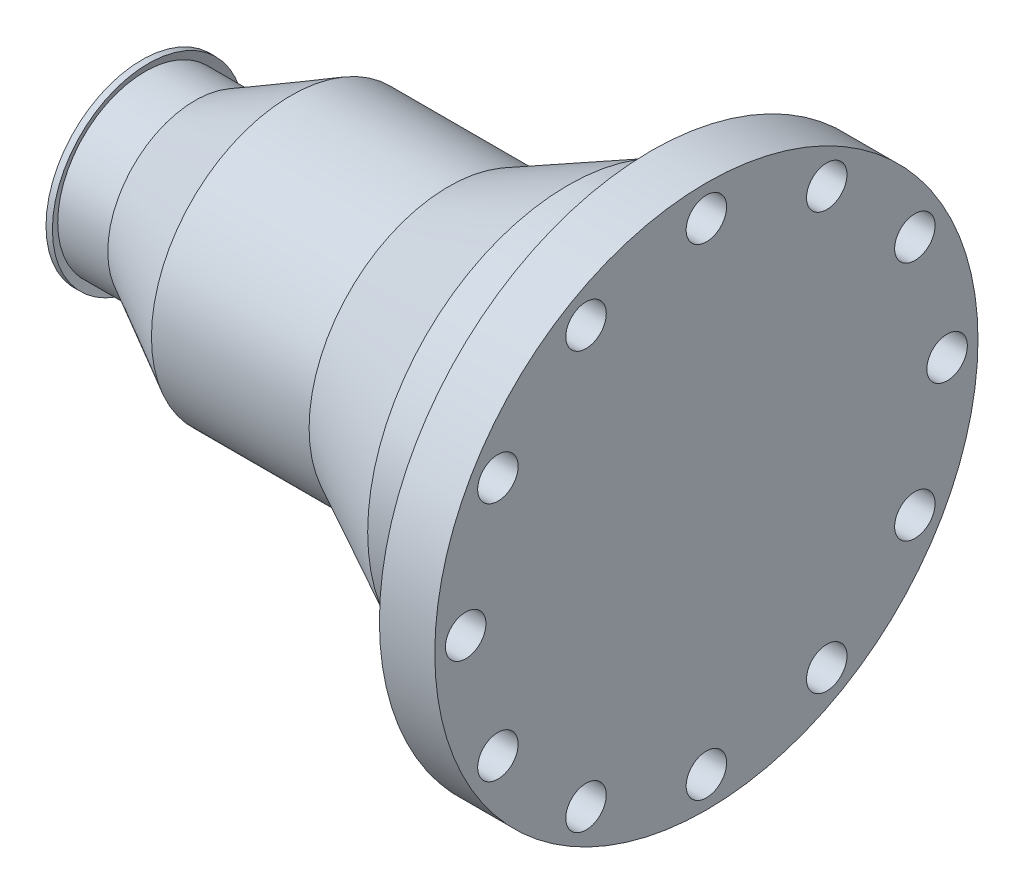
ISO-10303-21;
HEADER;
FILE_DESCRIPTION(('STEP AP214'),'2;1');
FILE_NAME('part.step','',(''),(''),'','','');
FILE_SCHEMA(('AUTOMOTIVE_DESIGN { 1 0 10303 214 1 1 1 1 }'));
ENDSEC;
DATA;
#1=APPLICATION_CONTEXT('core data for automotive mechanical design processes');
#2=APPLICATION_PROTOCOL_DEFINITION('international standard','automotive_design',2000,#1);
#3=PRODUCT_CONTEXT('',#1,'mechanical');
#4=PRODUCT('Part','Part','',(#3));
#5=PRODUCT_RELATED_PRODUCT_CATEGORY('part','',(#4));
#6=PRODUCT_DEFINITION_FORMATION('','',#4);
#7=PRODUCT_DEFINITION_CONTEXT('part definition',#1,'design');
#8=PRODUCT_DEFINITION('design','',#6,#7);
#9=PRODUCT_DEFINITION_SHAPE('','',#8);
#10=(LENGTH_UNIT() NAMED_UNIT(*) SI_UNIT(.MILLI.,.METRE.));
#11=(NAMED_UNIT(*) PLANE_ANGLE_UNIT() SI_UNIT($,.RADIAN.));
#12=(NAMED_UNIT(*) SI_UNIT($,.STERADIAN.) SOLID_ANGLE_UNIT());
#13=UNCERTAINTY_MEASURE_WITH_UNIT(LENGTH_MEASURE(1.E-05),#10,'distance_accuracy_value','');
#14=(GEOMETRIC_REPRESENTATION_CONTEXT(3) GLOBAL_UNCERTAINTY_ASSIGNED_CONTEXT((#13)) GLOBAL_UNIT_ASSIGNED_CONTEXT((#10,
#11,#12)) REPRESENTATION_CONTEXT('',''));
#15=CARTESIAN_POINT('',(0.,0.,0.));
#16=DIRECTION('',(0.,0.,1.));
#17=DIRECTION('',(1.,0.,0.));
#18=AXIS2_PLACEMENT_3D('',#15,#16,#17);
#19=CARTESIAN_POINT('',(0.,0.,0.));
#20=DIRECTION('',(1.,0.,0.));
#21=DIRECTION('',(0.,0.,-1.));
#22=AXIS2_PLACEMENT_3D('',#19,#20,#21);
#23=PLANE('',#22);
#24=CARTESIAN_POINT('',(0.,0.,0.));
#25=DIRECTION('',(-1.,0.,0.));
#26=DIRECTION('',(0.,0.,1.));
#27=AXIS2_PLACEMENT_3D('',#24,#25,#26);
#28=CIRCLE('',#27,45.);
#29=CARTESIAN_POINT('',(0.,0.,45.));
#30=VERTEX_POINT('',#29);
#31=EDGE_CURVE('E10',#30,#30,#28,.T.);
#32=ORIENTED_EDGE('',*,*,#31,.T.);
#33=EDGE_LOOP('',(#32));
#34=FACE_BOUND('',#33,.T.);
#35=ADVANCED_FACE('F37',(#34),#23,.F.);
#36=CARTESIAN_POINT('',(0.,0.,0.));
#37=DIRECTION('',(-1.,0.,0.));
#38=DIRECTION('',(0.,0.,1.));
#39=AXIS2_PLACEMENT_3D('',#36,#37,#38);
#40=CYLINDRICAL_SURFACE('',#39,45.);
#41=ORIENTED_EDGE('',*,*,#31,.F.);
#42=EDGE_LOOP('',(#41));
#43=FACE_BOUND('',#42,.T.);
#44=CARTESIAN_POINT('',(3.,0.,0.));
#45=DIRECTION('',(-1.,0.,0.));
#46=DIRECTION('',(0.,0.,1.));
#47=AXIS2_PLACEMENT_3D('',#44,#45,#46);
#48=CIRCLE('',#47,45.);
#49=CARTESIAN_POINT('',(3.,0.,45.));
#50=VERTEX_POINT('',#49);
#51=EDGE_CURVE('E43',#50,#50,#48,.T.);
#52=ORIENTED_EDGE('',*,*,#51,.T.);
#53=EDGE_LOOP('',(#52));
#54=FACE_BOUND('',#53,.T.);
#55=ADVANCED_FACE('F200',(#43,#54),#40,.T.);
#56=CARTESIAN_POINT('',(1.5,0.,0.));
#57=DIRECTION('',(1.,0.,0.));
#58=DIRECTION('',(0.,0.,-1.));
#59=AXIS2_PLACEMENT_3D('',#56,#57,#58);
#60=CONICAL_SURFACE('',#59,41.,1.21202565652432);
#61=ORIENTED_EDGE('',*,*,#51,.F.);
#62=EDGE_LOOP('',(#61));
#63=FACE_BOUND('',#62,.T.);
#64=CARTESIAN_POINT('',(1.5,0.,0.));
#65=DIRECTION('',(-1.,0.,0.));
#66=DIRECTION('',(0.,0.,1.));
#67=AXIS2_PLACEMENT_3D('',#64,#65,#66);
#68=CIRCLE('',#67,41.);
#69=CARTESIAN_POINT('',(1.5,0.,41.));
#70=VERTEX_POINT('',#69);
#71=EDGE_CURVE('E47',#70,#70,#68,.T.);
#72=ORIENTED_EDGE('',*,*,#71,.T.);
#73=EDGE_LOOP('',(#72));
#74=FACE_BOUND('',#73,.T.);
#75=ADVANCED_FACE('F204',(#63,#74),#60,.F.);
#76=CARTESIAN_POINT('',(0.,0.,0.));
#77=DIRECTION('',(-1.,0.,0.));
#78=DIRECTION('',(0.,0.,1.));
#79=AXIS2_PLACEMENT_3D('',#76,#77,#78);
#80=CYLINDRICAL_SURFACE('',#79,41.);
#81=ORIENTED_EDGE('',*,*,#71,.F.);
#82=EDGE_LOOP('',(#81));
#83=FACE_BOUND('',#82,.T.);
#84=CARTESIAN_POINT('',(25.,0.,0.));
#85=DIRECTION('',(-1.,0.,0.));
#86=DIRECTION('',(0.,0.,1.));
#87=AXIS2_PLACEMENT_3D('',#84,#85,#86);
#88=CIRCLE('',#87,41.);
#89=CARTESIAN_POINT('',(25.,0.,41.));
#90=VERTEX_POINT('',#89);
#91=EDGE_CURVE('E51',#90,#90,#88,.T.);
#92=ORIENTED_EDGE('',*,*,#91,.T.);
#93=EDGE_LOOP('',(#92));
#94=FACE_BOUND('',#93,.T.);
#95=ADVANCED_FACE('F209',(#83,#94),#80,.T.);
#96=CARTESIAN_POINT('',(70.,0.,0.));
#97=DIRECTION('',(1.,0.,0.));
#98=DIRECTION('',(0.,0.,-1.));
#99=AXIS2_PLACEMENT_3D('',#96,#97,#98);
#100=CONICAL_SURFACE('',#99,65.5,0.498567905638218);
#101=ORIENTED_EDGE('',*,*,#91,.F.);
#102=EDGE_LOOP('',(#101));
#103=FACE_BOUND('',#102,.T.);
#104=CARTESIAN_POINT('',(70.,0.,0.));
#105=DIRECTION('',(-1.,0.,0.));
#106=DIRECTION('',(0.,0.,1.));
#107=AXIS2_PLACEMENT_3D('',#104,#105,#106);
#108=CIRCLE('',#107,65.5);
#109=CARTESIAN_POINT('',(70.,0.,65.5));
#110=VERTEX_POINT('',#109);
#111=EDGE_CURVE('E56',#110,#110,#108,.T.);
#112=ORIENTED_EDGE('',*,*,#111,.T.);
#113=EDGE_LOOP('',(#112));
#114=FACE_BOUND('',#113,.T.);
#115=ADVANCED_FACE('F215',(#103,#114),#100,.T.);
#116=CARTESIAN_POINT('',(0.,0.,0.));
#117=DIRECTION('',(-1.,0.,0.));
#118=DIRECTION('',(0.,0.,1.));
#119=AXIS2_PLACEMENT_3D('',#116,#117,#118);
#120=CYLINDRICAL_SURFACE('',#119,65.5);
#121=ORIENTED_EDGE('',*,*,#111,.F.);
#122=EDGE_LOOP('',(#121));
#123=FACE_BOUND('',#122,.T.);
#124=CARTESIAN_POINT('',(144.,0.,0.));
#125=DIRECTION('',(-1.,0.,0.));
#126=DIRECTION('',(0.,0.,1.));
#127=AXIS2_PLACEMENT_3D('',#124,#125,#126);
#128=CIRCLE('',#127,65.5);
#129=CARTESIAN_POINT('',(144.,0.,65.5));
#130=VERTEX_POINT('',#129);
#131=EDGE_CURVE('E59',#130,#130,#128,.T.);
#132=ORIENTED_EDGE('',*,*,#131,.T.);
#133=EDGE_LOOP('',(#132));
#134=FACE_BOUND('',#133,.T.);
#135=ADVANCED_FACE('F219',(#123,#134),#120,.T.);
#136=CARTESIAN_POINT('',(200.,0.,0.));
#137=DIRECTION('',(1.,0.,0.));
#138=DIRECTION('',(0.,0.,-1.));
#139=AXIS2_PLACEMENT_3D('',#136,#137,#138);
#140=CONICAL_SURFACE('',#139,94.,0.470764926542016);
#141=ORIENTED_EDGE('',*,*,#131,.F.);
#142=EDGE_LOOP('',(#141));
#143=FACE_BOUND('',#142,.T.);
#144=CARTESIAN_POINT('',(200.,0.,0.));
#145=DIRECTION('',(-1.,0.,0.));
#146=DIRECTION('',(0.,0.,1.));
#147=AXIS2_PLACEMENT_3D('',#144,#145,#146);
#148=CIRCLE('',#147,94.);
#149=CARTESIAN_POINT('',(200.,0.,94.));
#150=VERTEX_POINT('',#149);
#151=EDGE_CURVE('E62',#150,#150,#148,.T.);
#152=ORIENTED_EDGE('',*,*,#151,.T.);
#153=EDGE_LOOP('',(#152));
#154=FACE_BOUND('',#153,.T.);
#155=ADVANCED_FACE('F223',(#143,#154),#140,.T.);
#156=CARTESIAN_POINT('',(0.,0.,0.));
#157=DIRECTION('',(-1.,0.,0.));
#158=DIRECTION('',(0.,0.,1.));
#159=AXIS2_PLACEMENT_3D('',#156,#157,#158);
#160=CYLINDRICAL_SURFACE('',#159,94.);
#161=ORIENTED_EDGE('',*,*,#151,.F.);
#162=EDGE_LOOP('',(#161));
#163=FACE_BOUND('',#162,.T.);
#164=CARTESIAN_POINT('',(220.,0.,0.));
#165=DIRECTION('',(-1.,0.,0.));
#166=DIRECTION('',(0.,0.,1.));
#167=AXIS2_PLACEMENT_3D('',#164,#165,#166);
#168=CIRCLE('',#167,94.);
#169=CARTESIAN_POINT('',(220.,0.,94.));
#170=VERTEX_POINT('',#169);
#171=EDGE_CURVE('E65',#170,#170,#168,.T.);
#172=ORIENTED_EDGE('',*,*,#171,.T.);
#173=EDGE_LOOP('',(#172));
#174=FACE_BOUND('',#173,.T.);
#175=ADVANCED_FACE('F227',(#163,#174),#160,.T.);
#176=CARTESIAN_POINT('',(220.,94.,0.));
#177=DIRECTION('',(1.,0.,0.));
#178=DIRECTION('',(0.,0.,-1.));
#179=AXIS2_PLACEMENT_3D('',#176,#177,#178);
#180=PLANE('',#179);
#181=ORIENTED_EDGE('',*,*,#171,.F.);
#182=EDGE_LOOP('',(#181));
#183=FACE_BOUND('',#182,.T.);
#184=CARTESIAN_POINT('',(220.,0.,0.));
#185=DIRECTION('',(-1.,0.,0.));
#186=DIRECTION('',(0.,0.,1.));
#187=AXIS2_PLACEMENT_3D('',#184,#185,#186);
#188=CIRCLE('',#187,95.);
#189=CARTESIAN_POINT('',(220.,0.,95.));
#190=VERTEX_POINT('',#189);
#191=EDGE_CURVE('E68',#190,#190,#188,.T.);
#192=ORIENTED_EDGE('',*,*,#191,.T.);
#193=EDGE_LOOP('',(#192));
#194=FACE_BOUND('',#193,.T.);
#195=ADVANCED_FACE('F231',(#183,#194),#180,.F.);
#196=CARTESIAN_POINT('',(0.,0.,0.));
#197=DIRECTION('',(-1.,0.,0.));
#198=DIRECTION('',(0.,0.,1.));
#199=AXIS2_PLACEMENT_3D('',#196,#197,#198);
#200=CYLINDRICAL_SURFACE('',#199,95.);
#201=ORIENTED_EDGE('',*,*,#191,.F.);
#202=EDGE_LOOP('',(#201));
#203=FACE_BOUND('',#202,.T.);
#204=CARTESIAN_POINT('',(239.,0.,0.));
#205=DIRECTION('',(-1.,0.,0.));
#206=DIRECTION('',(0.,0.,1.));
#207=AXIS2_PLACEMENT_3D('',#204,#205,#206);
#208=CIRCLE('',#207,95.);
#209=CARTESIAN_POINT('',(239.,0.,95.));
#210=VERTEX_POINT('',#209);
#211=EDGE_CURVE('E71',#210,#210,#208,.T.);
#212=ORIENTED_EDGE('',*,*,#211,.T.);
#213=EDGE_LOOP('',(#212));
#214=FACE_BOUND('',#213,.T.);
#215=ADVANCED_FACE('F195',(#203,#214),#200,.T.);
#216=CARTESIAN_POINT('',(239.,100.,0.));
#217=DIRECTION('',(1.,0.,0.));
#218=DIRECTION('',(0.,0.,-1.));
#219=AXIS2_PLACEMENT_3D('',#216,#217,#218);
#220=PLANE('',#219);
#221=CARTESIAN_POINT('',(239.,97.8608706276416,-56.5));
#222=DIRECTION('',(1.,0.,0.));
#223=DIRECTION('',(0.,0.,-1.));
#224=AXIS2_PLACEMENT_3D('',#221,#222,#223);
#225=CIRCLE('',#224,9.50000000000001);
#226=CARTESIAN_POINT('',(239.,97.8608706276416,-66.));
#227=VERTEX_POINT('',#226);
#228=EDGE_CURVE('E146',#227,#227,#225,.F.);
#229=ORIENTED_EDGE('',*,*,#228,.F.);
#230=EDGE_LOOP('',(#229));
#231=FACE_BOUND('',#230,.T.);
#232=CARTESIAN_POINT('',(239.,56.4999999999999,-97.8608706276416));
#233=DIRECTION('',(1.,0.,0.));
#234=DIRECTION('',(0.,0.,-1.));
#235=AXIS2_PLACEMENT_3D('',#232,#233,#234);
#236=CIRCLE('',#235,9.5);
#237=CARTESIAN_POINT('',(239.,56.4999999999999,-107.360870627642));
#238=VERTEX_POINT('',#237);
#239=EDGE_CURVE('E140',#238,#238,#236,.F.);
#240=ORIENTED_EDGE('',*,*,#239,.F.);
#241=EDGE_LOOP('',(#240));
#242=FACE_BOUND('',#241,.T.);
#243=CARTESIAN_POINT('',(239.,0.,-113.));
#244=DIRECTION('',(1.,0.,0.));
#245=DIRECTION('',(0.,0.,-1.));
#246=AXIS2_PLACEMENT_3D('',#243,#244,#245);
#247=CIRCLE('',#246,9.49999999999999);
#248=CARTESIAN_POINT('',(239.,0.,-122.5));
#249=VERTEX_POINT('',#248);
#250=EDGE_CURVE('E134',#249,#249,#247,.F.);
#251=ORIENTED_EDGE('',*,*,#250,.F.);
#252=EDGE_LOOP('',(#251));
#253=FACE_BOUND('',#252,.T.);
#254=CARTESIAN_POINT('',(239.,-56.5,-97.8608706276415));
#255=DIRECTION('',(1.,0.,0.));
#256=DIRECTION('',(0.,0.,-1.));
#257=AXIS2_PLACEMENT_3D('',#254,#255,#256);
#258=CIRCLE('',#257,9.5);
#259=CARTESIAN_POINT('',(239.,-56.5,-107.360870627642));
#260=VERTEX_POINT('',#259);
#261=EDGE_CURVE('E128',#260,#260,#258,.F.);
#262=ORIENTED_EDGE('',*,*,#261,.F.);
#263=EDGE_LOOP('',(#262));
#264=FACE_BOUND('',#263,.T.);
#265=CARTESIAN_POINT('',(239.,-97.8608706276416,-56.5));
#266=DIRECTION('',(1.,0.,0.));
#267=DIRECTION('',(0.,0.,-1.));
#268=AXIS2_PLACEMENT_3D('',#265,#266,#267);
#269=CIRCLE('',#268,9.50000000000001);
#270=CARTESIAN_POINT('',(239.,-97.8608706276416,-66.));
#271=VERTEX_POINT('',#270);
#272=EDGE_CURVE('E122',#271,#271,#269,.F.);
#273=ORIENTED_EDGE('',*,*,#272,.F.);
#274=EDGE_LOOP('',(#273));
#275=FACE_BOUND('',#274,.T.);
#276=CARTESIAN_POINT('',(239.,-113.,0.));
#277=DIRECTION('',(1.,0.,0.));
#278=DIRECTION('',(0.,0.,-1.));
#279=AXIS2_PLACEMENT_3D('',#276,#277,#278);
#280=CIRCLE('',#279,9.49999999999998);
#281=CARTESIAN_POINT('',(239.,-113.,-9.49999999999998));
#282=VERTEX_POINT('',#281);
#283=EDGE_CURVE('E116',#282,#282,#280,.F.);
#284=ORIENTED_EDGE('',*,*,#283,.F.);
#285=EDGE_LOOP('',(#284));
#286=FACE_BOUND('',#285,.T.);
#287=CARTESIAN_POINT('',(239.,-97.8608706276415,56.5));
#288=DIRECTION('',(1.,0.,0.));
#289=DIRECTION('',(0.,0.,-1.));
#290=AXIS2_PLACEMENT_3D('',#287,#288,#289);
#291=CIRCLE('',#290,9.5);
#292=CARTESIAN_POINT('',(239.,-97.8608706276415,47.));
#293=VERTEX_POINT('',#292);
#294=EDGE_CURVE('E110',#293,#293,#291,.F.);
#295=ORIENTED_EDGE('',*,*,#294,.F.);
#296=EDGE_LOOP('',(#295));
#297=FACE_BOUND('',#296,.T.);
#298=CARTESIAN_POINT('',(239.,-56.5,97.8608706276416));
#299=DIRECTION('',(1.,0.,0.));
#300=DIRECTION('',(0.,0.,-1.));
#301=AXIS2_PLACEMENT_3D('',#298,#299,#300);
#302=CIRCLE('',#301,9.5);
#303=CARTESIAN_POINT('',(239.,-56.5,88.3608706276416));
#304=VERTEX_POINT('',#303);
#305=EDGE_CURVE('E104',#304,#304,#302,.F.);
#306=ORIENTED_EDGE('',*,*,#305,.F.);
#307=EDGE_LOOP('',(#306));
#308=FACE_BOUND('',#307,.T.);
#309=CARTESIAN_POINT('',(239.,0.,113.));
#310=DIRECTION('',(1.,0.,0.));
#311=DIRECTION('',(0.,0.,-1.));
#312=AXIS2_PLACEMENT_3D('',#309,#310,#311);
#313=CIRCLE('',#312,9.49999999999999);
#314=CARTESIAN_POINT('',(239.,0.,103.5));
#315=VERTEX_POINT('',#314);
#316=EDGE_CURVE('E98',#315,#315,#313,.F.);
#317=ORIENTED_EDGE('',*,*,#316,.F.);
#318=EDGE_LOOP('',(#317));
#319=FACE_BOUND('',#318,.T.);
#320=CARTESIAN_POINT('',(239.,56.5,97.8608706276416));
#321=DIRECTION('',(1.,0.,0.));
#322=DIRECTION('',(0.,0.,-1.));
#323=AXIS2_PLACEMENT_3D('',#320,#321,#322);
#324=CIRCLE('',#323,9.5);
#325=CARTESIAN_POINT('',(239.,56.5,88.3608706276416));
#326=VERTEX_POINT('',#325);
#327=EDGE_CURVE('E92',#326,#326,#324,.F.);
#328=ORIENTED_EDGE('',*,*,#327,.F.);
#329=EDGE_LOOP('',(#328));
#330=FACE_BOUND('',#329,.T.);
#331=CARTESIAN_POINT('',(239.,97.8608706276416,56.5));
#332=DIRECTION('',(1.,0.,0.));
#333=DIRECTION('',(0.,0.,-1.));
#334=AXIS2_PLACEMENT_3D('',#331,#332,#333);
#335=CIRCLE('',#334,9.5);
#336=CARTESIAN_POINT('',(239.,97.8608706276416,47.));
#337=VERTEX_POINT('',#336);
#338=EDGE_CURVE('E86',#337,#337,#335,.F.);
#339=ORIENTED_EDGE('',*,*,#338,.F.);
#340=EDGE_LOOP('',(#339));
#341=FACE_BOUND('',#340,.T.);
#342=CARTESIAN_POINT('',(239.,113.,0.));
#343=DIRECTION('',(1.,0.,0.));
#344=DIRECTION('',(0.,0.,-1.));
#345=AXIS2_PLACEMENT_3D('',#342,#343,#344);
#346=CIRCLE('',#345,9.50000000000001);
#347=CARTESIAN_POINT('',(239.,113.,-9.50000000000001));
#348=VERTEX_POINT('',#347);
#349=EDGE_CURVE('E80',#348,#348,#346,.F.);
#350=ORIENTED_EDGE('',*,*,#349,.F.);
#351=EDGE_LOOP('',(#350));
#352=FACE_BOUND('',#351,.T.);
#353=ORIENTED_EDGE('',*,*,#211,.F.);
#354=EDGE_LOOP('',(#353));
#355=FACE_BOUND('',#354,.T.);
#356=CARTESIAN_POINT('',(239.,0.,0.));
#357=DIRECTION('',(-1.,0.,0.));
#358=DIRECTION('',(0.,0.,1.));
#359=AXIS2_PLACEMENT_3D('',#356,#357,#358);
#360=CIRCLE('',#359,127.5);
#361=CARTESIAN_POINT('',(239.,0.,127.5));
#362=VERTEX_POINT('',#361);
#363=EDGE_CURVE('E74',#362,#362,#360,.T.);
#364=ORIENTED_EDGE('',*,*,#363,.T.);
#365=EDGE_LOOP('',(#364));
#366=FACE_BOUND('',#365,.T.);
#367=ADVANCED_FACE('F187',(#231,#242,#253,#264,#275,#286,#297,#308,#319,#330,#341,#352,#355,
#366),#220,.F.);
#368=CARTESIAN_POINT('',(0.,0.,0.));
#369=DIRECTION('',(-1.,0.,0.));
#370=DIRECTION('',(0.,0.,1.));
#371=AXIS2_PLACEMENT_3D('',#368,#369,#370);
#372=CYLINDRICAL_SURFACE('',#371,127.5);
#373=ORIENTED_EDGE('',*,*,#363,.F.);
#374=EDGE_LOOP('',(#373));
#375=FACE_BOUND('',#374,.T.);
#376=CARTESIAN_POINT('',(265.,0.,0.));
#377=DIRECTION('',(-1.,0.,0.));
#378=DIRECTION('',(0.,0.,1.));
#379=AXIS2_PLACEMENT_3D('',#376,#377,#378);
#380=CIRCLE('',#379,127.5);
#381=CARTESIAN_POINT('',(265.,0.,127.5));
#382=VERTEX_POINT('',#381);
#383=EDGE_CURVE('E77',#382,#382,#380,.T.);
#384=ORIENTED_EDGE('',*,*,#383,.T.);
#385=EDGE_LOOP('',(#384));
#386=FACE_BOUND('',#385,.T.);
#387=ADVANCED_FACE('F160',(#375,#386),#372,.T.);
#388=CARTESIAN_POINT('',(265.,127.5,0.));
#389=DIRECTION('',(-1.,0.,0.));
#390=DIRECTION('',(0.,0.,1.));
#391=AXIS2_PLACEMENT_3D('',#388,#389,#390);
#392=PLANE('',#391);
#393=CARTESIAN_POINT('',(265.,97.8608706276416,-56.5));
#394=DIRECTION('',(1.,0.,0.));
#395=DIRECTION('',(0.,0.,-1.));
#396=AXIS2_PLACEMENT_3D('',#393,#394,#395);
#397=CIRCLE('',#396,9.50000000000001);
#398=CARTESIAN_POINT('',(265.,97.8608706276416,-66.));
#399=VERTEX_POINT('',#398);
#400=EDGE_CURVE('E149',#399,#399,#397,.T.);
#401=ORIENTED_EDGE('',*,*,#400,.F.);
#402=EDGE_LOOP('',(#401));
#403=FACE_BOUND('',#402,.T.);
#404=CARTESIAN_POINT('',(265.,56.4999999999999,-97.8608706276416));
#405=DIRECTION('',(1.,0.,0.));
#406=DIRECTION('',(0.,0.,-1.));
#407=AXIS2_PLACEMENT_3D('',#404,#405,#406);
#408=CIRCLE('',#407,9.5);
#409=CARTESIAN_POINT('',(265.,56.4999999999999,-107.360870627642));
#410=VERTEX_POINT('',#409);
#411=EDGE_CURVE('E143',#410,#410,#408,.T.);
#412=ORIENTED_EDGE('',*,*,#411,.F.);
#413=EDGE_LOOP('',(#412));
#414=FACE_BOUND('',#413,.T.);
#415=CARTESIAN_POINT('',(265.,0.,-113.));
#416=DIRECTION('',(1.,0.,0.));
#417=DIRECTION('',(0.,0.,-1.));
#418=AXIS2_PLACEMENT_3D('',#415,#416,#417);
#419=CIRCLE('',#418,9.49999999999999);
#420=CARTESIAN_POINT('',(265.,0.,-122.5));
#421=VERTEX_POINT('',#420);
#422=EDGE_CURVE('E137',#421,#421,#419,.T.);
#423=ORIENTED_EDGE('',*,*,#422,.F.);
#424=EDGE_LOOP('',(#423));
#425=FACE_BOUND('',#424,.T.);
#426=CARTESIAN_POINT('',(265.,-56.5,-97.8608706276415));
#427=DIRECTION('',(1.,0.,0.));
#428=DIRECTION('',(0.,0.,-1.));
#429=AXIS2_PLACEMENT_3D('',#426,#427,#428);
#430=CIRCLE('',#429,9.5);
#431=CARTESIAN_POINT('',(265.,-56.5,-107.360870627642));
#432=VERTEX_POINT('',#431);
#433=EDGE_CURVE('E131',#432,#432,#430,.T.);
#434=ORIENTED_EDGE('',*,*,#433,.F.);
#435=EDGE_LOOP('',(#434));
#436=FACE_BOUND('',#435,.T.);
#437=CARTESIAN_POINT('',(265.,-97.8608706276416,-56.5));
#438=DIRECTION('',(1.,0.,0.));
#439=DIRECTION('',(0.,0.,-1.));
#440=AXIS2_PLACEMENT_3D('',#437,#438,#439);
#441=CIRCLE('',#440,9.50000000000001);
#442=CARTESIAN_POINT('',(265.,-97.8608706276416,-66.));
#443=VERTEX_POINT('',#442);
#444=EDGE_CURVE('E125',#443,#443,#441,.T.);
#445=ORIENTED_EDGE('',*,*,#444,.F.);
#446=EDGE_LOOP('',(#445));
#447=FACE_BOUND('',#446,.T.);
#448=CARTESIAN_POINT('',(265.,-113.,0.));
#449=DIRECTION('',(1.,0.,0.));
#450=DIRECTION('',(0.,0.,-1.));
#451=AXIS2_PLACEMENT_3D('',#448,#449,#450);
#452=CIRCLE('',#451,9.49999999999998);
#453=CARTESIAN_POINT('',(265.,-113.,-9.49999999999998));
#454=VERTEX_POINT('',#453);
#455=EDGE_CURVE('E119',#454,#454,#452,.T.);
#456=ORIENTED_EDGE('',*,*,#455,.F.);
#457=EDGE_LOOP('',(#456));
#458=FACE_BOUND('',#457,.T.);
#459=CARTESIAN_POINT('',(265.,-97.8608706276415,56.5));
#460=DIRECTION('',(1.,0.,0.));
#461=DIRECTION('',(0.,0.,-1.));
#462=AXIS2_PLACEMENT_3D('',#459,#460,#461);
#463=CIRCLE('',#462,9.5);
#464=CARTESIAN_POINT('',(265.,-97.8608706276415,47.));
#465=VERTEX_POINT('',#464);
#466=EDGE_CURVE('E113',#465,#465,#463,.T.);
#467=ORIENTED_EDGE('',*,*,#466,.F.);
#468=EDGE_LOOP('',(#467));
#469=FACE_BOUND('',#468,.T.);
#470=CARTESIAN_POINT('',(265.,-56.5,97.8608706276416));
#471=DIRECTION('',(1.,0.,0.));
#472=DIRECTION('',(0.,0.,-1.));
#473=AXIS2_PLACEMENT_3D('',#470,#471,#472);
#474=CIRCLE('',#473,9.5);
#475=CARTESIAN_POINT('',(265.,-56.5,88.3608706276416));
#476=VERTEX_POINT('',#475);
#477=EDGE_CURVE('E107',#476,#476,#474,.T.);
#478=ORIENTED_EDGE('',*,*,#477,.F.);
#479=EDGE_LOOP('',(#478));
#480=FACE_BOUND('',#479,.T.);
#481=CARTESIAN_POINT('',(265.,0.,113.));
#482=DIRECTION('',(1.,0.,0.));
#483=DIRECTION('',(0.,0.,-1.));
#484=AXIS2_PLACEMENT_3D('',#481,#482,#483);
#485=CIRCLE('',#484,9.49999999999999);
#486=CARTESIAN_POINT('',(265.,0.,103.5));
#487=VERTEX_POINT('',#486);
#488=EDGE_CURVE('E101',#487,#487,#485,.T.);
#489=ORIENTED_EDGE('',*,*,#488,.F.);
#490=EDGE_LOOP('',(#489));
#491=FACE_BOUND('',#490,.T.);
#492=CARTESIAN_POINT('',(265.,56.5,97.8608706276416));
#493=DIRECTION('',(1.,0.,0.));
#494=DIRECTION('',(0.,0.,-1.));
#495=AXIS2_PLACEMENT_3D('',#492,#493,#494);
#496=CIRCLE('',#495,9.5);
#497=CARTESIAN_POINT('',(265.,56.5,88.3608706276416));
#498=VERTEX_POINT('',#497);
#499=EDGE_CURVE('E95',#498,#498,#496,.T.);
#500=ORIENTED_EDGE('',*,*,#499,.F.);
#501=EDGE_LOOP('',(#500));
#502=FACE_BOUND('',#501,.T.);
#503=CARTESIAN_POINT('',(265.,97.8608706276416,56.5));
#504=DIRECTION('',(1.,0.,0.));
#505=DIRECTION('',(0.,0.,-1.));
#506=AXIS2_PLACEMENT_3D('',#503,#504,#505);
#507=CIRCLE('',#506,9.5);
#508=CARTESIAN_POINT('',(265.,97.8608706276416,47.));
#509=VERTEX_POINT('',#508);
#510=EDGE_CURVE('E89',#509,#509,#507,.T.);
#511=ORIENTED_EDGE('',*,*,#510,.F.);
#512=EDGE_LOOP('',(#511));
#513=FACE_BOUND('',#512,.T.);
#514=CARTESIAN_POINT('',(265.,113.,0.));
#515=DIRECTION('',(1.,0.,0.));
#516=DIRECTION('',(0.,0.,-1.));
#517=AXIS2_PLACEMENT_3D('',#514,#515,#516);
#518=CIRCLE('',#517,9.50000000000001);
#519=CARTESIAN_POINT('',(265.,113.,-9.50000000000001));
#520=VERTEX_POINT('',#519);
#521=EDGE_CURVE('E83',#520,#520,#518,.T.);
#522=ORIENTED_EDGE('',*,*,#521,.F.);
#523=EDGE_LOOP('',(#522));
#524=FACE_BOUND('',#523,.T.);
#525=ORIENTED_EDGE('',*,*,#383,.F.);
#526=EDGE_LOOP('',(#525));
#527=FACE_BOUND('',#526,.T.);
#528=ADVANCED_FACE('F156',(#403,#414,#425,#436,#447,#458,#469,#480,#491,#502,#513,#524,#527),
#392,.F.);
#529=CARTESIAN_POINT('',(265.,113.,0.));
#530=DIRECTION('',(-1.,0.,0.));
#531=DIRECTION('',(0.,0.,1.));
#532=AXIS2_PLACEMENT_3D('',#529,#530,#531);
#533=CYLINDRICAL_SURFACE('',#532,9.50000000000001);
#534=ORIENTED_EDGE('',*,*,#521,.T.);
#535=EDGE_LOOP('',(#534));
#536=FACE_BOUND('',#535,.T.);
#537=ORIENTED_EDGE('',*,*,#349,.T.);
#538=EDGE_LOOP('',(#537));
#539=FACE_BOUND('',#538,.T.);
#540=ADVANCED_FACE('F159',(#536,#539),#533,.F.);
#541=CARTESIAN_POINT('',(265.,97.8608706276416,56.5));
#542=DIRECTION('',(-1.,0.,0.));
#543=DIRECTION('',(0.,0.,1.));
#544=AXIS2_PLACEMENT_3D('',#541,#542,#543);
#545=CYLINDRICAL_SURFACE('',#544,9.5);
#546=ORIENTED_EDGE('',*,*,#510,.T.);
#547=EDGE_LOOP('',(#546));
#548=FACE_BOUND('',#547,.T.);
#549=ORIENTED_EDGE('',*,*,#338,.T.);
#550=EDGE_LOOP('',(#549));
#551=FACE_BOUND('',#550,.T.);
#552=ADVANCED_FACE('F318',(#548,#551),#545,.F.);
#553=CARTESIAN_POINT('',(265.,56.5,97.8608706276416));
#554=DIRECTION('',(-1.,0.,0.));
#555=DIRECTION('',(0.,0.,1.));
#556=AXIS2_PLACEMENT_3D('',#553,#554,#555);
#557=CYLINDRICAL_SURFACE('',#556,9.5);
#558=ORIENTED_EDGE('',*,*,#499,.T.);
#559=EDGE_LOOP('',(#558));
#560=FACE_BOUND('',#559,.T.);
#561=ORIENTED_EDGE('',*,*,#327,.T.);
#562=EDGE_LOOP('',(#561));
#563=FACE_BOUND('',#562,.T.);
#564=ADVANCED_FACE('F327',(#560,#563),#557,.F.);
#565=CARTESIAN_POINT('',(265.,0.,113.));
#566=DIRECTION('',(-1.,0.,0.));
#567=DIRECTION('',(0.,0.,1.));
#568=AXIS2_PLACEMENT_3D('',#565,#566,#567);
#569=CYLINDRICAL_SURFACE('',#568,9.49999999999999);
#570=ORIENTED_EDGE('',*,*,#488,.T.);
#571=EDGE_LOOP('',(#570));
#572=FACE_BOUND('',#571,.T.);
#573=ORIENTED_EDGE('',*,*,#316,.T.);
#574=EDGE_LOOP('',(#573));
#575=FACE_BOUND('',#574,.T.);
#576=ADVANCED_FACE('F336',(#572,#575),#569,.F.);
#577=CARTESIAN_POINT('',(265.,-56.5,97.8608706276416));
#578=DIRECTION('',(-1.,0.,0.));
#579=DIRECTION('',(0.,0.,1.));
#580=AXIS2_PLACEMENT_3D('',#577,#578,#579);
#581=CYLINDRICAL_SURFACE('',#580,9.5);
#582=ORIENTED_EDGE('',*,*,#477,.T.);
#583=EDGE_LOOP('',(#582));
#584=FACE_BOUND('',#583,.T.);
#585=ORIENTED_EDGE('',*,*,#305,.T.);
#586=EDGE_LOOP('',(#585));
#587=FACE_BOUND('',#586,.T.);
#588=ADVANCED_FACE('F345',(#584,#587),#581,.F.);
#589=CARTESIAN_POINT('',(265.,-97.8608706276415,56.5));
#590=DIRECTION('',(-1.,0.,0.));
#591=DIRECTION('',(0.,0.,1.));
#592=AXIS2_PLACEMENT_3D('',#589,#590,#591);
#593=CYLINDRICAL_SURFACE('',#592,9.5);
#594=ORIENTED_EDGE('',*,*,#466,.T.);
#595=EDGE_LOOP('',(#594));
#596=FACE_BOUND('',#595,.T.);
#597=ORIENTED_EDGE('',*,*,#294,.T.);
#598=EDGE_LOOP('',(#597));
#599=FACE_BOUND('',#598,.T.);
#600=ADVANCED_FACE('F354',(#596,#599),#593,.F.);
#601=CARTESIAN_POINT('',(265.,-113.,0.));
#602=DIRECTION('',(-1.,0.,0.));
#603=DIRECTION('',(0.,0.,1.));
#604=AXIS2_PLACEMENT_3D('',#601,#602,#603);
#605=CYLINDRICAL_SURFACE('',#604,9.49999999999998);
#606=ORIENTED_EDGE('',*,*,#455,.T.);
#607=EDGE_LOOP('',(#606));
#608=FACE_BOUND('',#607,.T.);
#609=ORIENTED_EDGE('',*,*,#283,.T.);
#610=EDGE_LOOP('',(#609));
#611=FACE_BOUND('',#610,.T.);
#612=ADVANCED_FACE('F363',(#608,#611),#605,.F.);
#613=CARTESIAN_POINT('',(265.,-97.8608706276416,-56.5));
#614=DIRECTION('',(-1.,0.,0.));
#615=DIRECTION('',(0.,0.,1.));
#616=AXIS2_PLACEMENT_3D('',#613,#614,#615);
#617=CYLINDRICAL_SURFACE('',#616,9.50000000000001);
#618=ORIENTED_EDGE('',*,*,#444,.T.);
#619=EDGE_LOOP('',(#618));
#620=FACE_BOUND('',#619,.T.);
#621=ORIENTED_EDGE('',*,*,#272,.T.);
#622=EDGE_LOOP('',(#621));
#623=FACE_BOUND('',#622,.T.);
#624=ADVANCED_FACE('F372',(#620,#623),#617,.F.);
#625=CARTESIAN_POINT('',(265.,-56.5,-97.8608706276415));
#626=DIRECTION('',(-1.,0.,0.));
#627=DIRECTION('',(0.,0.,1.));
#628=AXIS2_PLACEMENT_3D('',#625,#626,#627);
#629=CYLINDRICAL_SURFACE('',#628,9.5);
#630=ORIENTED_EDGE('',*,*,#433,.T.);
#631=EDGE_LOOP('',(#630));
#632=FACE_BOUND('',#631,.T.);
#633=ORIENTED_EDGE('',*,*,#261,.T.);
#634=EDGE_LOOP('',(#633));
#635=FACE_BOUND('',#634,.T.);
#636=ADVANCED_FACE('F381',(#632,#635),#629,.F.);
#637=CARTESIAN_POINT('',(265.,0.,-113.));
#638=DIRECTION('',(-1.,0.,0.));
#639=DIRECTION('',(0.,0.,1.));
#640=AXIS2_PLACEMENT_3D('',#637,#638,#639);
#641=CYLINDRICAL_SURFACE('',#640,9.49999999999999);
#642=ORIENTED_EDGE('',*,*,#422,.T.);
#643=EDGE_LOOP('',(#642));
#644=FACE_BOUND('',#643,.T.);
#645=ORIENTED_EDGE('',*,*,#250,.T.);
#646=EDGE_LOOP('',(#645));
#647=FACE_BOUND('',#646,.T.);
#648=ADVANCED_FACE('F390',(#644,#647),#641,.F.);
#649=CARTESIAN_POINT('',(265.,56.4999999999999,-97.8608706276416));
#650=DIRECTION('',(-1.,0.,0.));
#651=DIRECTION('',(0.,0.,1.));
#652=AXIS2_PLACEMENT_3D('',#649,#650,#651);
#653=CYLINDRICAL_SURFACE('',#652,9.5);
#654=ORIENTED_EDGE('',*,*,#411,.T.);
#655=EDGE_LOOP('',(#654));
#656=FACE_BOUND('',#655,.T.);
#657=ORIENTED_EDGE('',*,*,#239,.T.);
#658=EDGE_LOOP('',(#657));
#659=FACE_BOUND('',#658,.T.);
#660=ADVANCED_FACE('F399',(#656,#659),#653,.F.);
#661=CARTESIAN_POINT('',(265.,97.8608706276416,-56.5));
#662=DIRECTION('',(-1.,0.,0.));
#663=DIRECTION('',(0.,0.,1.));
#664=AXIS2_PLACEMENT_3D('',#661,#662,#663);
#665=CYLINDRICAL_SURFACE('',#664,9.50000000000001);
#666=ORIENTED_EDGE('',*,*,#400,.T.);
#667=EDGE_LOOP('',(#666));
#668=FACE_BOUND('',#667,.T.);
#669=ORIENTED_EDGE('',*,*,#228,.T.);
#670=EDGE_LOOP('',(#669));
#671=FACE_BOUND('',#670,.T.);
#672=ADVANCED_FACE('F153',(#668,#671),#665,.F.);
#673=CLOSED_SHELL('',(#35,#55,#75,#95,#115,#135,#155,#175,#195,#215,#367,#387,#528,#540,#552,
#564,#576,#588,#600,#612,#624,#636,#648,#660,#672));
#674=MANIFOLD_SOLID_BREP('B2',#673);
#675=ADVANCED_BREP_SHAPE_REPRESENTATION('',(#18,#674),#14);
#676=SHAPE_DEFINITION_REPRESENTATION(#9,#675);
ENDSEC;
END-ISO-10303-21;
